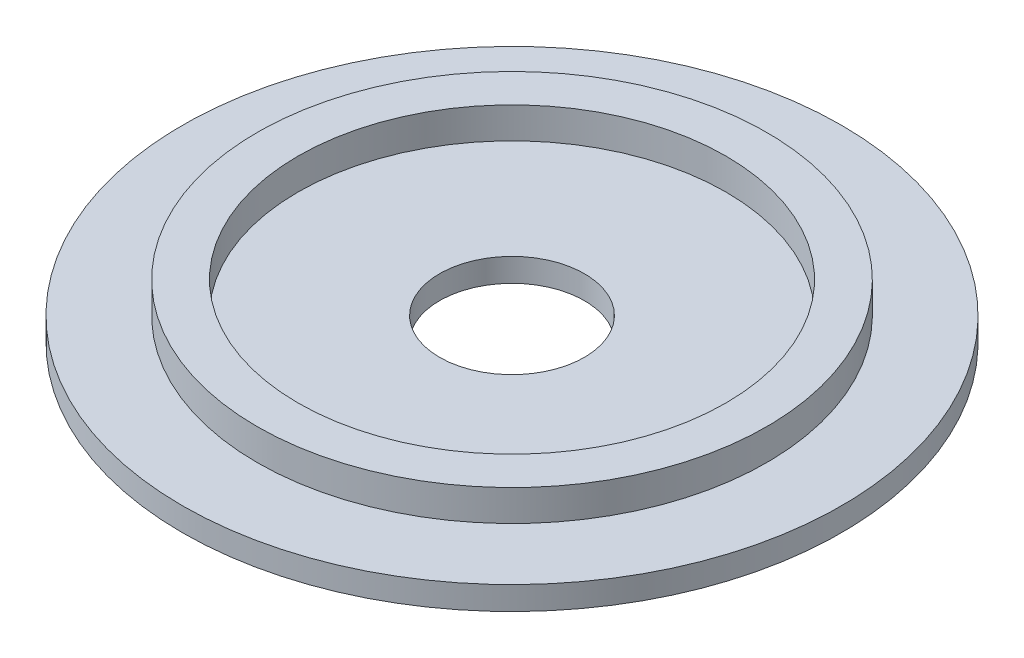
ISO-10303-21;
HEADER;
FILE_DESCRIPTION(('STEP AP214'),'2;1');
FILE_NAME('part.step','',(''),(''),'','','');
FILE_SCHEMA(('AUTOMOTIVE_DESIGN { 1 0 10303 214 1 1 1 1 }'));
ENDSEC;
DATA;
#1=APPLICATION_CONTEXT('core data for automotive mechanical design processes');
#2=APPLICATION_PROTOCOL_DEFINITION('international standard','automotive_design',2000,#1);
#3=PRODUCT_CONTEXT('',#1,'mechanical');
#4=PRODUCT('Part','Part','',(#3));
#5=PRODUCT_RELATED_PRODUCT_CATEGORY('part','',(#4));
#6=PRODUCT_DEFINITION_FORMATION('','',#4);
#7=PRODUCT_DEFINITION_CONTEXT('part definition',#1,'design');
#8=PRODUCT_DEFINITION('design','',#6,#7);
#9=PRODUCT_DEFINITION_SHAPE('','',#8);
#10=(LENGTH_UNIT() NAMED_UNIT(*) SI_UNIT(.MILLI.,.METRE.));
#11=(NAMED_UNIT(*) PLANE_ANGLE_UNIT() SI_UNIT($,.RADIAN.));
#12=(NAMED_UNIT(*) SI_UNIT($,.STERADIAN.) SOLID_ANGLE_UNIT());
#13=UNCERTAINTY_MEASURE_WITH_UNIT(LENGTH_MEASURE(1.E-05),#10,'distance_accuracy_value','');
#14=(GEOMETRIC_REPRESENTATION_CONTEXT(3) GLOBAL_UNCERTAINTY_ASSIGNED_CONTEXT((#13)) GLOBAL_UNIT_ASSIGNED_CONTEXT((#10,
#11,#12)) REPRESENTATION_CONTEXT('',''));
#15=CARTESIAN_POINT('',(0.,0.,0.));
#16=DIRECTION('',(0.,0.,1.));
#17=DIRECTION('',(1.,0.,0.));
#18=AXIS2_PLACEMENT_3D('',#15,#16,#17);
#19=CARTESIAN_POINT('',(0.,1.5,0.));
#20=DIRECTION('',(0.,1.,0.));
#21=DIRECTION('',(0.,0.,1.));
#22=AXIS2_PLACEMENT_3D('',#19,#20,#21);
#23=PLANE('',#22);
#24=CARTESIAN_POINT('',(0.,1.5,0.));
#25=DIRECTION('',(0.,1.,0.));
#26=DIRECTION('',(0.,0.,1.));
#27=AXIS2_PLACEMENT_3D('',#24,#25,#26);
#28=CIRCLE('',#27,4.65);
#29=CARTESIAN_POINT('',(0.,1.5,4.65));
#30=VERTEX_POINT('',#29);
#31=EDGE_CURVE('E52',#30,#30,#28,.T.);
#32=ORIENTED_EDGE('',*,*,#31,.F.);
#33=EDGE_LOOP('',(#32));
#34=FACE_BOUND('',#33,.T.);
#35=CARTESIAN_POINT('',(0.,1.5,0.));
#36=DIRECTION('',(0.,1.,0.));
#37=DIRECTION('',(0.,0.,1.));
#38=AXIS2_PLACEMENT_3D('',#35,#36,#37);
#39=CIRCLE('',#38,13.7289903486564);
#40=CARTESIAN_POINT('',(0.,1.5,13.7289903486564));
#41=VERTEX_POINT('',#40);
#42=EDGE_CURVE('E10',#41,#41,#39,.F.);
#43=ORIENTED_EDGE('',*,*,#42,.F.);
#44=EDGE_LOOP('',(#43));
#45=FACE_BOUND('',#44,.T.);
#46=ADVANCED_FACE('F43',(#34,#45),#23,.T.);
#47=CARTESIAN_POINT('',(0.,1.5,0.));
#48=DIRECTION('',(0.,-1.,0.));
#49=DIRECTION('',(0.,0.,-1.));
#50=AXIS2_PLACEMENT_3D('',#47,#48,#49);
#51=CYLINDRICAL_SURFACE('',#50,21.15);
#52=CARTESIAN_POINT('',(0.,1.5,0.));
#53=DIRECTION('',(0.,1.,0.));
#54=DIRECTION('',(0.,0.,1.));
#55=AXIS2_PLACEMENT_3D('',#52,#53,#54);
#56=CIRCLE('',#55,21.15);
#57=CARTESIAN_POINT('',(0.,1.5,21.15));
#58=VERTEX_POINT('',#57);
#59=EDGE_CURVE('E58',#58,#58,#56,.T.);
#60=ORIENTED_EDGE('',*,*,#59,.F.);
#61=EDGE_LOOP('',(#60));
#62=FACE_BOUND('',#61,.T.);
#63=CARTESIAN_POINT('',(0.,0.,0.));
#64=DIRECTION('',(0.,1.,0.));
#65=DIRECTION('',(0.,0.,1.));
#66=AXIS2_PLACEMENT_3D('',#63,#64,#65);
#67=CIRCLE('',#66,21.15);
#68=CARTESIAN_POINT('',(0.,0.,21.15));
#69=VERTEX_POINT('',#68);
#70=EDGE_CURVE('E66',#69,#69,#67,.T.);
#71=ORIENTED_EDGE('',*,*,#70,.T.);
#72=EDGE_LOOP('',(#71));
#73=FACE_BOUND('',#72,.T.);
#74=ADVANCED_FACE('F45',(#62,#73),#51,.T.);
#75=CARTESIAN_POINT('',(0.,1.5,0.));
#76=DIRECTION('',(0.,-1.,0.));
#77=DIRECTION('',(0.,0.,-1.));
#78=AXIS2_PLACEMENT_3D('',#75,#76,#77);
#79=CYLINDRICAL_SURFACE('',#78,4.65);
#80=ORIENTED_EDGE('',*,*,#31,.T.);
#81=EDGE_LOOP('',(#80));
#82=FACE_BOUND('',#81,.T.);
#83=CARTESIAN_POINT('',(0.,0.,0.));
#84=DIRECTION('',(0.,1.,0.));
#85=DIRECTION('',(0.,0.,1.));
#86=AXIS2_PLACEMENT_3D('',#83,#84,#85);
#87=CIRCLE('',#86,4.65);
#88=CARTESIAN_POINT('',(0.,0.,4.65));
#89=VERTEX_POINT('',#88);
#90=EDGE_CURVE('E47',#89,#89,#87,.T.);
#91=ORIENTED_EDGE('',*,*,#90,.F.);
#92=EDGE_LOOP('',(#91));
#93=FACE_BOUND('',#92,.T.);
#94=ADVANCED_FACE('F106',(#82,#93),#79,.F.);
#95=CARTESIAN_POINT('',(0.,1.5,0.));
#96=DIRECTION('',(0.,1.,0.));
#97=DIRECTION('',(0.,0.,1.));
#98=AXIS2_PLACEMENT_3D('',#95,#96,#97);
#99=CIRCLE('',#98,16.3531906495068);
#100=CARTESIAN_POINT('',(0.,1.5,16.3531906495068));
#101=VERTEX_POINT('',#100);
#102=EDGE_CURVE('E62',#101,#101,#99,.F.);
#103=ORIENTED_EDGE('',*,*,#102,.T.);
#104=EDGE_LOOP('',(#103));
#105=FACE_BOUND('',#104,.T.);
#106=ORIENTED_EDGE('',*,*,#59,.T.);
#107=EDGE_LOOP('',(#106));
#108=FACE_BOUND('',#107,.T.);
#109=ADVANCED_FACE('F102',(#105,#108),#23,.T.);
#110=CARTESIAN_POINT('',(0.,0.,0.));
#111=DIRECTION('',(0.,1.,0.));
#112=DIRECTION('',(0.,0.,1.));
#113=AXIS2_PLACEMENT_3D('',#110,#111,#112);
#114=PLANE('',#113);
#115=ORIENTED_EDGE('',*,*,#70,.F.);
#116=EDGE_LOOP('',(#115));
#117=FACE_BOUND('',#116,.T.);
#118=ORIENTED_EDGE('',*,*,#90,.T.);
#119=EDGE_LOOP('',(#118));
#120=FACE_BOUND('',#119,.T.);
#121=ADVANCED_FACE('F113',(#117,#120),#114,.F.);
#122=CARTESIAN_POINT('',(0.,3.5,0.));
#123=DIRECTION('',(0.,-1.,0.));
#124=DIRECTION('',(0.,0.,-1.));
#125=AXIS2_PLACEMENT_3D('',#122,#123,#124);
#126=CYLINDRICAL_SURFACE('',#125,13.7289903486564);
#127=ORIENTED_EDGE('',*,*,#42,.T.);
#128=EDGE_LOOP('',(#127));
#129=FACE_BOUND('',#128,.T.);
#130=CARTESIAN_POINT('',(0.,3.5,0.));
#131=DIRECTION('',(0.,1.,0.));
#132=DIRECTION('',(0.,0.,1.));
#133=AXIS2_PLACEMENT_3D('',#130,#131,#132);
#134=CIRCLE('',#133,13.7289903486564);
#135=CARTESIAN_POINT('',(0.,3.5,13.7289903486564));
#136=VERTEX_POINT('',#135);
#137=EDGE_CURVE('E80',#136,#136,#134,.T.);
#138=ORIENTED_EDGE('',*,*,#137,.T.);
#139=EDGE_LOOP('',(#138));
#140=FACE_BOUND('',#139,.T.);
#141=ADVANCED_FACE('F88',(#129,#140),#126,.F.);
#142=CARTESIAN_POINT('',(0.,3.5,0.));
#143=DIRECTION('',(0.,-1.,0.));
#144=DIRECTION('',(0.,0.,-1.));
#145=AXIS2_PLACEMENT_3D('',#142,#143,#144);
#146=CYLINDRICAL_SURFACE('',#145,16.3531906495068);
#147=ORIENTED_EDGE('',*,*,#102,.F.);
#148=EDGE_LOOP('',(#147));
#149=FACE_BOUND('',#148,.T.);
#150=CARTESIAN_POINT('',(0.,3.5,0.));
#151=DIRECTION('',(0.,1.,0.));
#152=DIRECTION('',(0.,0.,1.));
#153=AXIS2_PLACEMENT_3D('',#150,#151,#152);
#154=CIRCLE('',#153,16.3531906495068);
#155=CARTESIAN_POINT('',(0.,3.5,16.3531906495068));
#156=VERTEX_POINT('',#155);
#157=EDGE_CURVE('E75',#156,#156,#154,.T.);
#158=ORIENTED_EDGE('',*,*,#157,.F.);
#159=EDGE_LOOP('',(#158));
#160=FACE_BOUND('',#159,.T.);
#161=ADVANCED_FACE('F92',(#149,#160),#146,.T.);
#162=CARTESIAN_POINT('',(0.,3.5,0.));
#163=DIRECTION('',(0.,1.,0.));
#164=DIRECTION('',(0.,0.,1.));
#165=AXIS2_PLACEMENT_3D('',#162,#163,#164);
#166=PLANE('',#165);
#167=ORIENTED_EDGE('',*,*,#137,.F.);
#168=EDGE_LOOP('',(#167));
#169=FACE_BOUND('',#168,.T.);
#170=ORIENTED_EDGE('',*,*,#157,.T.);
#171=EDGE_LOOP('',(#170));
#172=FACE_BOUND('',#171,.T.);
#173=ADVANCED_FACE('F90',(#169,#172),#166,.T.);
#174=CLOSED_SHELL('',(#46,#74,#94,#109,#121,#141,#161,#173));
#175=MANIFOLD_SOLID_BREP('B2',#174);
#176=ADVANCED_BREP_SHAPE_REPRESENTATION('',(#18,#175),#14);
#177=SHAPE_DEFINITION_REPRESENTATION(#9,#176);
ENDSEC;
END-ISO-10303-21;
